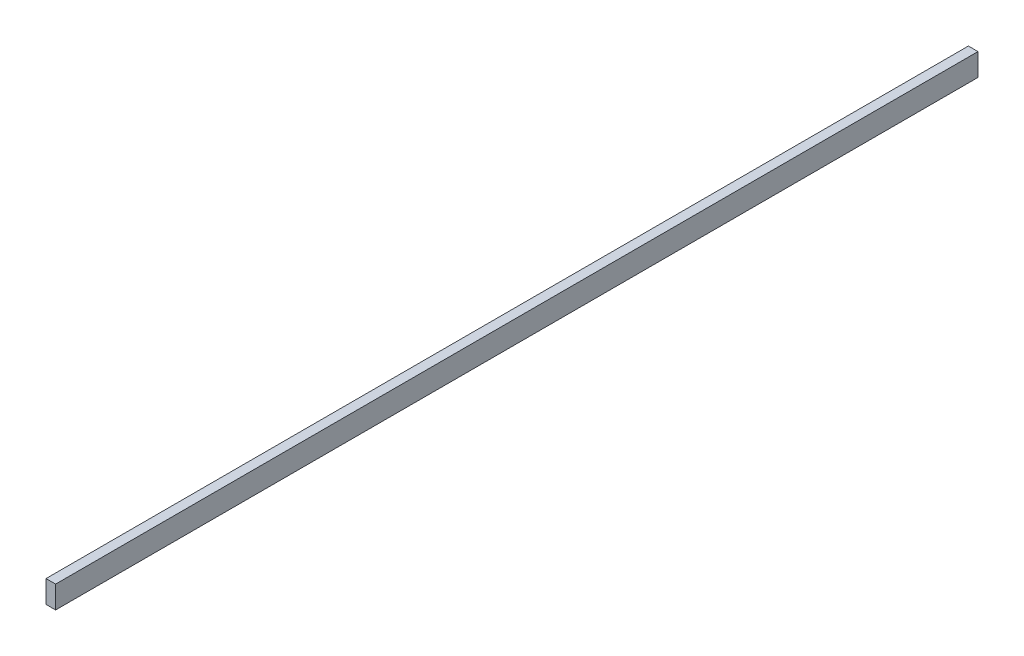
ISO-10303-21;
HEADER;
FILE_DESCRIPTION(('STEP AP214'),'2;1');
FILE_NAME('part.step','',(''),(''),'','','');
FILE_SCHEMA(('AUTOMOTIVE_DESIGN { 1 0 10303 214 1 1 1 1 }'));
ENDSEC;
DATA;
#1=APPLICATION_CONTEXT('core data for automotive mechanical design processes');
#2=APPLICATION_PROTOCOL_DEFINITION('international standard','automotive_design',2000,#1);
#3=PRODUCT_CONTEXT('',#1,'mechanical');
#4=PRODUCT('Part','Part','',(#3));
#5=PRODUCT_RELATED_PRODUCT_CATEGORY('part','',(#4));
#6=PRODUCT_DEFINITION_FORMATION('','',#4);
#7=PRODUCT_DEFINITION_CONTEXT('part definition',#1,'design');
#8=PRODUCT_DEFINITION('design','',#6,#7);
#9=PRODUCT_DEFINITION_SHAPE('','',#8);
#10=(LENGTH_UNIT() NAMED_UNIT(*) SI_UNIT(.MILLI.,.METRE.));
#11=(NAMED_UNIT(*) PLANE_ANGLE_UNIT() SI_UNIT($,.RADIAN.));
#12=(NAMED_UNIT(*) SI_UNIT($,.STERADIAN.) SOLID_ANGLE_UNIT());
#13=UNCERTAINTY_MEASURE_WITH_UNIT(LENGTH_MEASURE(1.E-05),#10,'distance_accuracy_value','');
#14=(GEOMETRIC_REPRESENTATION_CONTEXT(3) GLOBAL_UNCERTAINTY_ASSIGNED_CONTEXT((#13)) GLOBAL_UNIT_ASSIGNED_CONTEXT((#10,
#11,#12)) REPRESENTATION_CONTEXT('',''));
#15=CARTESIAN_POINT('',(0.,0.,0.));
#16=DIRECTION('',(0.,0.,1.));
#17=DIRECTION('',(1.,0.,0.));
#18=AXIS2_PLACEMENT_3D('',#15,#16,#17);
#19=CARTESIAN_POINT('',(-19.05,44.45,1828.8));
#20=DIRECTION('',(1.,0.,0.));
#21=DIRECTION('',(0.,1.,0.));
#22=AXIS2_PLACEMENT_3D('',#19,#20,#21);
#23=PLANE('',#22);
#24=DIRECTION('',(0.,-1.,0.));
#25=VECTOR('',#24,1.);
#26=CARTESIAN_POINT('',(-19.05,44.45,-1828.8));
#27=LINE('',#26,#25);
#28=CARTESIAN_POINT('',(-19.05,44.45,-1828.8));
#29=VERTEX_POINT('',#28);
#30=CARTESIAN_POINT('',(-19.05,-44.45,-1828.8));
#31=VERTEX_POINT('',#30);
#32=EDGE_CURVE('E95',#29,#31,#27,.T.);
#33=ORIENTED_EDGE('',*,*,#32,.T.);
#34=DIRECTION('',(0.,0.,-1.));
#35=VECTOR('',#34,1.);
#36=CARTESIAN_POINT('',(-19.05,-44.45,1828.8));
#37=LINE('',#36,#35);
#38=CARTESIAN_POINT('',(-19.05,-44.45,1828.8));
#39=VERTEX_POINT('',#38);
#40=EDGE_CURVE('E11',#39,#31,#37,.T.);
#41=ORIENTED_EDGE('',*,*,#40,.F.);
#42=DIRECTION('',(0.,-1.,0.));
#43=VECTOR('',#42,1.);
#44=CARTESIAN_POINT('',(-19.05,44.45,1828.8));
#45=LINE('',#44,#43);
#46=CARTESIAN_POINT('',(-19.05,44.45,1828.8));
#47=VERTEX_POINT('',#46);
#48=EDGE_CURVE('E83',#47,#39,#45,.T.);
#49=ORIENTED_EDGE('',*,*,#48,.F.);
#50=DIRECTION('',(0.,0.,-1.));
#51=VECTOR('',#50,1.);
#52=CARTESIAN_POINT('',(-19.05,44.45,1828.8));
#53=LINE('',#52,#51);
#54=EDGE_CURVE('E91',#47,#29,#53,.T.);
#55=ORIENTED_EDGE('',*,*,#54,.T.);
#56=EDGE_LOOP('',(#33,#41,#49,#55));
#57=FACE_BOUND('',#56,.T.);
#58=ADVANCED_FACE('F32',(#57),#23,.F.);
#59=CARTESIAN_POINT('',(-19.05,-44.45,1828.8));
#60=DIRECTION('',(0.,1.,0.));
#61=DIRECTION('',(0.,0.,1.));
#62=AXIS2_PLACEMENT_3D('',#59,#60,#61);
#63=PLANE('',#62);
#64=DIRECTION('',(1.,0.,0.));
#65=VECTOR('',#64,1.);
#66=CARTESIAN_POINT('',(-19.05,-44.45,-1828.8));
#67=LINE('',#66,#65);
#68=CARTESIAN_POINT('',(19.05,-44.45,-1828.8));
#69=VERTEX_POINT('',#68);
#70=EDGE_CURVE('E87',#31,#69,#67,.T.);
#71=ORIENTED_EDGE('',*,*,#70,.T.);
#72=DIRECTION('',(0.,0.,-1.));
#73=VECTOR('',#72,1.);
#74=CARTESIAN_POINT('',(19.05,-44.45,1828.8));
#75=LINE('',#74,#73);
#76=CARTESIAN_POINT('',(19.05,-44.45,1828.8));
#77=VERTEX_POINT('',#76);
#78=EDGE_CURVE('E40',#77,#69,#75,.T.);
#79=ORIENTED_EDGE('',*,*,#78,.F.);
#80=DIRECTION('',(1.,0.,0.));
#81=VECTOR('',#80,1.);
#82=CARTESIAN_POINT('',(-19.05,-44.45,1828.8));
#83=LINE('',#82,#81);
#84=EDGE_CURVE('E78',#39,#77,#83,.T.);
#85=ORIENTED_EDGE('',*,*,#84,.F.);
#86=ORIENTED_EDGE('',*,*,#40,.T.);
#87=EDGE_LOOP('',(#71,#79,#85,#86));
#88=FACE_BOUND('',#87,.T.);
#89=ADVANCED_FACE('F86',(#88),#63,.F.);
#90=CARTESIAN_POINT('',(19.05,44.45,1828.8));
#91=DIRECTION('',(-1.,0.,0.));
#92=DIRECTION('',(0.,-1.,0.));
#93=AXIS2_PLACEMENT_3D('',#90,#91,#92);
#94=PLANE('',#93);
#95=DIRECTION('',(0.,1.,0.));
#96=VECTOR('',#95,1.);
#97=CARTESIAN_POINT('',(19.05,44.45,-1828.8));
#98=LINE('',#97,#96);
#99=CARTESIAN_POINT('',(19.05,44.45,-1828.8));
#100=VERTEX_POINT('',#99);
#101=EDGE_CURVE('E65',#69,#100,#98,.T.);
#102=ORIENTED_EDGE('',*,*,#101,.T.);
#103=DIRECTION('',(0.,0.,-1.));
#104=VECTOR('',#103,1.);
#105=CARTESIAN_POINT('',(19.05,44.45,1828.8));
#106=LINE('',#105,#104);
#107=CARTESIAN_POINT('',(19.05,44.45,1828.8));
#108=VERTEX_POINT('',#107);
#109=EDGE_CURVE('E88',#108,#100,#106,.T.);
#110=ORIENTED_EDGE('',*,*,#109,.F.);
#111=DIRECTION('',(0.,1.,0.));
#112=VECTOR('',#111,1.);
#113=CARTESIAN_POINT('',(19.05,44.45,1828.8));
#114=LINE('',#113,#112);
#115=EDGE_CURVE('E81',#77,#108,#114,.T.);
#116=ORIENTED_EDGE('',*,*,#115,.F.);
#117=ORIENTED_EDGE('',*,*,#78,.T.);
#118=EDGE_LOOP('',(#102,#110,#116,#117));
#119=FACE_BOUND('',#118,.T.);
#120=ADVANCED_FACE('F89',(#119),#94,.F.);
#121=CARTESIAN_POINT('',(-19.05,44.45,1828.8));
#122=DIRECTION('',(0.,-1.,0.));
#123=DIRECTION('',(0.,0.,-1.));
#124=AXIS2_PLACEMENT_3D('',#121,#122,#123);
#125=PLANE('',#124);
#126=DIRECTION('',(-1.,0.,0.));
#127=VECTOR('',#126,1.);
#128=CARTESIAN_POINT('',(-19.05,44.45,-1828.8));
#129=LINE('',#128,#127);
#130=EDGE_CURVE('E71',#100,#29,#129,.T.);
#131=ORIENTED_EDGE('',*,*,#130,.T.);
#132=ORIENTED_EDGE('',*,*,#54,.F.);
#133=DIRECTION('',(-1.,0.,0.));
#134=VECTOR('',#133,1.);
#135=CARTESIAN_POINT('',(-19.05,44.45,1828.8));
#136=LINE('',#135,#134);
#137=EDGE_CURVE('E48',#108,#47,#136,.T.);
#138=ORIENTED_EDGE('',*,*,#137,.F.);
#139=ORIENTED_EDGE('',*,*,#109,.T.);
#140=EDGE_LOOP('',(#131,#132,#138,#139));
#141=FACE_BOUND('',#140,.T.);
#142=ADVANCED_FACE('F102',(#141),#125,.F.);
#143=CARTESIAN_POINT('',(-19.05,44.45,1828.8));
#144=DIRECTION('',(0.,0.,1.));
#145=DIRECTION('',(1.,0.,0.));
#146=AXIS2_PLACEMENT_3D('',#143,#144,#145);
#147=PLANE('',#146);
#148=ORIENTED_EDGE('',*,*,#48,.T.);
#149=ORIENTED_EDGE('',*,*,#84,.T.);
#150=ORIENTED_EDGE('',*,*,#115,.T.);
#151=ORIENTED_EDGE('',*,*,#137,.T.);
#152=EDGE_LOOP('',(#148,#149,#150,#151));
#153=FACE_BOUND('',#152,.T.);
#154=ADVANCED_FACE('F79',(#153),#147,.T.);
#155=CARTESIAN_POINT('',(-19.05,44.45,-1828.8));
#156=DIRECTION('',(0.,0.,1.));
#157=DIRECTION('',(1.,0.,0.));
#158=AXIS2_PLACEMENT_3D('',#155,#156,#157);
#159=PLANE('',#158);
#160=ORIENTED_EDGE('',*,*,#32,.F.);
#161=ORIENTED_EDGE('',*,*,#130,.F.);
#162=ORIENTED_EDGE('',*,*,#101,.F.);
#163=ORIENTED_EDGE('',*,*,#70,.F.);
#164=EDGE_LOOP('',(#160,#161,#162,#163));
#165=FACE_BOUND('',#164,.T.);
#166=ADVANCED_FACE('F105',(#165),#159,.F.);
#167=CLOSED_SHELL('',(#58,#89,#120,#142,#154,#166));
#168=MANIFOLD_SOLID_BREP('B2',#167);
#169=ADVANCED_BREP_SHAPE_REPRESENTATION('',(#18,#168),#14);
#170=SHAPE_DEFINITION_REPRESENTATION(#9,#169);
ENDSEC;
END-ISO-10303-21;
